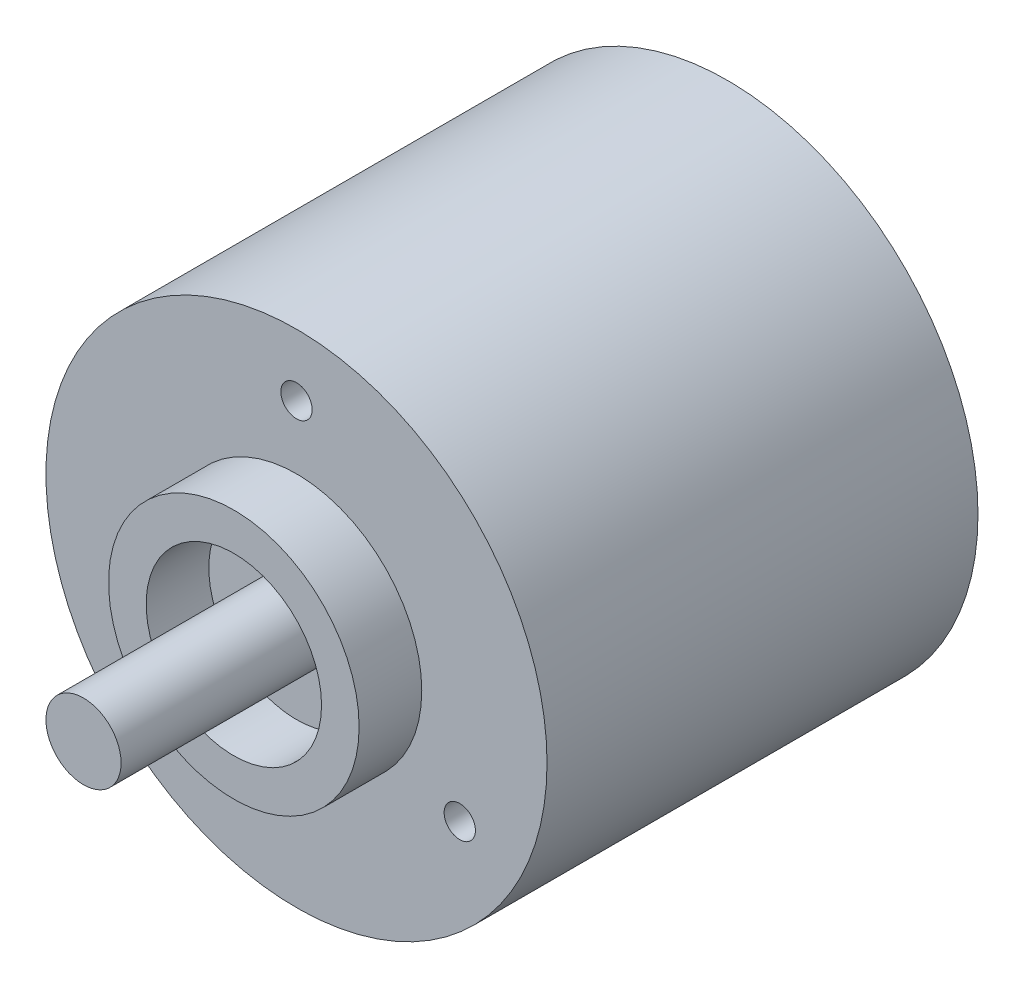
ISO-10303-21;
HEADER;
FILE_DESCRIPTION(('STEP AP214'),'2;1');
FILE_NAME('part.step','',(''),(''),'','','');
FILE_SCHEMA(('AUTOMOTIVE_DESIGN { 1 0 10303 214 1 1 1 1 }'));
ENDSEC;
DATA;
#1=APPLICATION_CONTEXT('core data for automotive mechanical design processes');
#2=APPLICATION_PROTOCOL_DEFINITION('international standard','automotive_design',2000,#1);
#3=PRODUCT_CONTEXT('',#1,'mechanical');
#4=PRODUCT('Part','Part','',(#3));
#5=PRODUCT_RELATED_PRODUCT_CATEGORY('part','',(#4));
#6=PRODUCT_DEFINITION_FORMATION('','',#4);
#7=PRODUCT_DEFINITION_CONTEXT('part definition',#1,'design');
#8=PRODUCT_DEFINITION('design','',#6,#7);
#9=PRODUCT_DEFINITION_SHAPE('','',#8);
#10=(LENGTH_UNIT() NAMED_UNIT(*) SI_UNIT(.MILLI.,.METRE.));
#11=(NAMED_UNIT(*) PLANE_ANGLE_UNIT() SI_UNIT($,.RADIAN.));
#12=(NAMED_UNIT(*) SI_UNIT($,.STERADIAN.) SOLID_ANGLE_UNIT());
#13=UNCERTAINTY_MEASURE_WITH_UNIT(LENGTH_MEASURE(1.E-05),#10,'distance_accuracy_value','');
#14=(GEOMETRIC_REPRESENTATION_CONTEXT(3) GLOBAL_UNCERTAINTY_ASSIGNED_CONTEXT((#13)) GLOBAL_UNIT_ASSIGNED_CONTEXT((#10,
#11,#12)) REPRESENTATION_CONTEXT('',''));
#15=CARTESIAN_POINT('',(0.,0.,0.));
#16=DIRECTION('',(0.,0.,1.));
#17=DIRECTION('',(1.,0.,0.));
#18=AXIS2_PLACEMENT_3D('',#15,#16,#17);
#19=CARTESIAN_POINT('',(0.,0.,-34.4));
#20=DIRECTION('',(0.,0.,1.));
#21=DIRECTION('',(1.,0.,0.));
#22=AXIS2_PLACEMENT_3D('',#19,#20,#21);
#23=CYLINDRICAL_SURFACE('',#22,20.);
#24=CARTESIAN_POINT('',(0.,0.,-34.4));
#25=DIRECTION('',(0.,0.,1.));
#26=DIRECTION('',(1.,0.,0.));
#27=AXIS2_PLACEMENT_3D('',#24,#25,#26);
#28=CIRCLE('',#27,20.);
#29=CARTESIAN_POINT('',(20.,0.,-34.4));
#30=VERTEX_POINT('',#29);
#31=EDGE_CURVE('E38',#30,#30,#28,.T.);
#32=CARTESIAN_POINT('',(0.,0.,0.));
#33=DIRECTION('',(0.,0.,1.));
#34=DIRECTION('',(1.,0.,0.));
#35=AXIS2_PLACEMENT_3D('',#32,#33,#34);
#36=CIRCLE('',#35,20.);
#37=CARTESIAN_POINT('',(20.,0.,0.));
#38=VERTEX_POINT('',#37);
#39=EDGE_CURVE('E42',#38,#38,#36,.T.);
#40=CARTESIAN_POINT('',(20.,0.,-34.4));
#41=CARTESIAN_POINT('',(20.,0.,-34.0416666666667));
#42=CARTESIAN_POINT('',(20.,0.,-33.6833333333333));
#43=CARTESIAN_POINT('',(20.,0.,-32.9666666666667));
#44=CARTESIAN_POINT('',(20.,0.,-32.6083333333333));
#45=CARTESIAN_POINT('',(20.,0.,-31.8916666666667));
#46=CARTESIAN_POINT('',(20.,0.,-31.5333333333333));
#47=CARTESIAN_POINT('',(20.,0.,-30.8166666666667));
#48=CARTESIAN_POINT('',(20.,0.,-30.4583333333333));
#49=CARTESIAN_POINT('',(20.,0.,-29.7416666666667));
#50=CARTESIAN_POINT('',(20.,0.,-29.3833333333333));
#51=CARTESIAN_POINT('',(20.,0.,-28.6666666666667));
#52=CARTESIAN_POINT('',(20.,0.,-28.3083333333333));
#53=CARTESIAN_POINT('',(20.,0.,-27.5916666666667));
#54=CARTESIAN_POINT('',(20.,0.,-27.2333333333333));
#55=CARTESIAN_POINT('',(20.,0.,-26.5166666666667));
#56=CARTESIAN_POINT('',(20.,0.,-26.1583333333333));
#57=CARTESIAN_POINT('',(20.,0.,-25.4416666666667));
#58=CARTESIAN_POINT('',(20.,0.,-25.0833333333333));
#59=CARTESIAN_POINT('',(20.,0.,-24.3666666666667));
#60=CARTESIAN_POINT('',(20.,0.,-24.0083333333333));
#61=CARTESIAN_POINT('',(20.,0.,-23.2916666666667));
#62=CARTESIAN_POINT('',(20.,0.,-22.9333333333333));
#63=CARTESIAN_POINT('',(20.,0.,-22.2166666666667));
#64=CARTESIAN_POINT('',(20.,0.,-21.8583333333333));
#65=CARTESIAN_POINT('',(20.,0.,-21.1416666666667));
#66=CARTESIAN_POINT('',(20.,0.,-20.7833333333333));
#67=CARTESIAN_POINT('',(20.,0.,-20.0666666666667));
#68=CARTESIAN_POINT('',(20.,0.,-19.7083333333333));
#69=CARTESIAN_POINT('',(20.,0.,-18.9916666666667));
#70=CARTESIAN_POINT('',(20.,0.,-18.6333333333333));
#71=CARTESIAN_POINT('',(20.,0.,-17.9166666666667));
#72=CARTESIAN_POINT('',(20.,0.,-17.5583333333333));
#73=CARTESIAN_POINT('',(20.,0.,-16.8416666666667));
#74=CARTESIAN_POINT('',(20.,0.,-16.4833333333333));
#75=CARTESIAN_POINT('',(20.,0.,-15.7666666666667));
#76=CARTESIAN_POINT('',(20.,0.,-15.4083333333333));
#77=CARTESIAN_POINT('',(20.,0.,-14.6916666666667));
#78=CARTESIAN_POINT('',(20.,0.,-14.3333333333333));
#79=CARTESIAN_POINT('',(20.,0.,-13.6166666666667));
#80=CARTESIAN_POINT('',(20.,0.,-13.2583333333333));
#81=CARTESIAN_POINT('',(20.,0.,-12.5416666666667));
#82=CARTESIAN_POINT('',(20.,0.,-12.1833333333333));
#83=CARTESIAN_POINT('',(20.,0.,-11.4666666666667));
#84=CARTESIAN_POINT('',(20.,0.,-11.1083333333333));
#85=CARTESIAN_POINT('',(20.,0.,-10.3916666666667));
#86=CARTESIAN_POINT('',(20.,0.,-10.0333333333333));
#87=CARTESIAN_POINT('',(20.,0.,-9.31666666666667));
#88=CARTESIAN_POINT('',(20.,0.,-8.95833333333334));
#89=CARTESIAN_POINT('',(20.,0.,-8.24166666666667));
#90=CARTESIAN_POINT('',(20.,0.,-7.88333333333334));
#91=CARTESIAN_POINT('',(20.,0.,-7.16666666666667));
#92=CARTESIAN_POINT('',(20.,0.,-6.80833333333334));
#93=CARTESIAN_POINT('',(20.,0.,-6.09166666666667));
#94=CARTESIAN_POINT('',(20.,0.,-5.73333333333334));
#95=CARTESIAN_POINT('',(20.,0.,-5.01666666666667));
#96=CARTESIAN_POINT('',(20.,0.,-4.65833333333334));
#97=CARTESIAN_POINT('',(20.,0.,-3.94166666666667));
#98=CARTESIAN_POINT('',(20.,0.,-3.58333333333334));
#99=CARTESIAN_POINT('',(20.,0.,-2.86666666666667));
#100=CARTESIAN_POINT('',(20.,0.,-2.50833333333334));
#101=CARTESIAN_POINT('',(20.,0.,-1.79166666666667));
#102=CARTESIAN_POINT('',(20.,0.,-1.43333333333334));
#103=CARTESIAN_POINT('',(20.,0.,-0.716666666666673));
#104=CARTESIAN_POINT('',(20.,0.,-0.35833333333334));
#105=CARTESIAN_POINT('',(20.,0.,0.));
#106=B_SPLINE_CURVE_WITH_KNOTS('',3,(#40,#41,#42,#43,#44,#45,#46,#47,#48,#49,#50,#51,#52,#53,
#54,#55,#56,#57,#58,#59,#60,#61,#62,#63,#64,#65,#66,#67,#68,#69,#70,#71,#72,#73,#74,#75,#76,#77,
#78,#79,#80,#81,#82,#83,#84,#85,#86,#87,#88,#89,#90,#91,#92,#93,#94,#95,#96,#97,#98,#99,#100,
#101,#102,#103,#104,#105),.UNSPECIFIED.,.F.,.F.,(4,2,2,2,2,2,2,2,2,2,2,2,2,2,2,2,2,2,2,2,2,2,2,
2,2,2,2,2,2,2,2,2,4),(0.,1.075,2.15,3.225,4.29999999999999,5.37499999999999,6.45,7.525,8.6,
9.675,10.75,11.825,12.9,13.975,15.05,16.125,17.2,18.275,19.35,20.425,21.5,22.575,23.65,24.725,
25.8,26.875,27.95,29.025,30.1,31.175,32.25,33.325,34.4),.UNSPECIFIED.);
#107=EDGE_CURVE('BSEAM32',#30,#38,#106,.T.);
#108=ORIENTED_EDGE('',*,*,#31,.T.);
#109=ORIENTED_EDGE('',*,*,#39,.F.);
#110=ORIENTED_EDGE('',*,*,#107,.T.);
#111=ORIENTED_EDGE('',*,*,#107,.F.);
#112=EDGE_LOOP('',(#108,#110,#109,#111));
#113=FACE_BOUND('',#112,.T.);
#114=ADVANCED_FACE('F32',(#113),#23,.T.);
#115=CARTESIAN_POINT('',(0.,0.,-34.4));
#116=DIRECTION('',(0.,0.,1.));
#117=DIRECTION('',(1.,0.,0.));
#118=AXIS2_PLACEMENT_3D('',#115,#116,#117);
#119=PLANE('',#118);
#120=ORIENTED_EDGE('',*,*,#31,.F.);
#121=EDGE_LOOP('',(#120));
#122=FACE_BOUND('',#121,.T.);
#123=ADVANCED_FACE('F95',(#122),#119,.F.);
#124=CARTESIAN_POINT('',(0.,0.,0.));
#125=DIRECTION('',(0.,0.,1.));
#126=DIRECTION('',(1.,0.,0.));
#127=AXIS2_PLACEMENT_3D('',#124,#125,#126);
#128=PLANE('',#127);
#129=CARTESIAN_POINT('',(-13.0336823269548,-7.52500000000056,0.));
#130=DIRECTION('',(0.,0.,1.));
#131=DIRECTION('',(1.,0.,0.));
#132=AXIS2_PLACEMENT_3D('',#129,#130,#131);
#133=CIRCLE('',#132,1.25000000000122);
#134=CARTESIAN_POINT('',(-11.7836823269536,-7.52500000000056,0.));
#135=VERTEX_POINT('',#134);
#136=EDGE_CURVE('E76',#135,#135,#133,.T.);
#137=ORIENTED_EDGE('',*,*,#136,.F.);
#138=EDGE_LOOP('',(#137));
#139=FACE_BOUND('',#138,.T.);
#140=CARTESIAN_POINT('',(13.0336823269568,-7.52499999999944,0.));
#141=DIRECTION('',(0.,0.,1.));
#142=DIRECTION('',(1.,0.,0.));
#143=AXIS2_PLACEMENT_3D('',#140,#141,#142);
#144=CIRCLE('',#143,1.25000000000083);
#145=CARTESIAN_POINT('',(14.2836823269576,-7.52499999999944,0.));
#146=VERTEX_POINT('',#145);
#147=EDGE_CURVE('E70',#146,#146,#144,.T.);
#148=ORIENTED_EDGE('',*,*,#147,.F.);
#149=EDGE_LOOP('',(#148));
#150=FACE_BOUND('',#149,.T.);
#151=CARTESIAN_POINT('',(0.,15.05,0.));
#152=DIRECTION('',(0.,0.,1.));
#153=DIRECTION('',(1.,0.,0.));
#154=AXIS2_PLACEMENT_3D('',#151,#152,#153);
#155=CIRCLE('',#154,1.25);
#156=CARTESIAN_POINT('',(1.25,15.05,0.));
#157=VERTEX_POINT('',#156);
#158=EDGE_CURVE('E64',#157,#157,#155,.T.);
#159=ORIENTED_EDGE('',*,*,#158,.F.);
#160=EDGE_LOOP('',(#159));
#161=FACE_BOUND('',#160,.T.);
#162=CARTESIAN_POINT('',(0.,0.,0.));
#163=DIRECTION('',(0.,0.,1.));
#164=DIRECTION('',(1.,0.,0.));
#165=AXIS2_PLACEMENT_3D('',#162,#163,#164);
#166=CIRCLE('',#165,10.);
#167=CARTESIAN_POINT('',(10.,0.,0.));
#168=VERTEX_POINT('',#167);
#169=EDGE_CURVE('E49',#168,#168,#166,.T.);
#170=ORIENTED_EDGE('',*,*,#169,.F.);
#171=EDGE_LOOP('',(#170));
#172=FACE_BOUND('',#171,.T.);
#173=ORIENTED_EDGE('',*,*,#39,.T.);
#174=EDGE_LOOP('',(#173));
#175=FACE_BOUND('',#174,.T.);
#176=ADVANCED_FACE('F91',(#139,#150,#161,#172,#175),#128,.T.);
#177=CARTESIAN_POINT('',(0.,0.,5.));
#178=DIRECTION('',(0.,0.,1.));
#179=DIRECTION('',(1.,0.,0.));
#180=AXIS2_PLACEMENT_3D('',#177,#178,#179);
#181=PLANE('',#180);
#182=CARTESIAN_POINT('',(0.,0.,5.));
#183=DIRECTION('',(0.,0.,1.));
#184=DIRECTION('',(1.,0.,0.));
#185=AXIS2_PLACEMENT_3D('',#182,#183,#184);
#186=CIRCLE('',#185,10.);
#187=CARTESIAN_POINT('',(10.,0.,5.));
#188=VERTEX_POINT('',#187);
#189=EDGE_CURVE('E47',#188,#188,#186,.T.);
#190=ORIENTED_EDGE('',*,*,#189,.T.);
#191=EDGE_LOOP('',(#190));
#192=FACE_BOUND('',#191,.T.);
#193=CARTESIAN_POINT('',(0.,0.,5.));
#194=DIRECTION('',(0.,0.,1.));
#195=DIRECTION('',(1.,0.,0.));
#196=AXIS2_PLACEMENT_3D('',#193,#194,#195);
#197=CIRCLE('',#196,7.);
#198=CARTESIAN_POINT('',(7.,0.,5.));
#199=VERTEX_POINT('',#198);
#200=EDGE_CURVE('E52',#199,#199,#197,.T.);
#201=ORIENTED_EDGE('',*,*,#200,.F.);
#202=EDGE_LOOP('',(#201));
#203=FACE_BOUND('',#202,.T.);
#204=ADVANCED_FACE('F94',(#192,#203),#181,.T.);
#205=CARTESIAN_POINT('',(0.,0.,5.));
#206=DIRECTION('',(0.,0.,-1.));
#207=DIRECTION('',(-1.,0.,0.));
#208=AXIS2_PLACEMENT_3D('',#205,#206,#207);
#209=CYLINDRICAL_SURFACE('',#208,10.);
#210=ORIENTED_EDGE('',*,*,#189,.F.);
#211=EDGE_LOOP('',(#210));
#212=FACE_BOUND('',#211,.T.);
#213=ORIENTED_EDGE('',*,*,#169,.T.);
#214=EDGE_LOOP('',(#213));
#215=FACE_BOUND('',#214,.T.);
#216=ADVANCED_FACE('F114',(#212,#215),#209,.T.);
#217=CARTESIAN_POINT('',(0.,0.,5.));
#218=DIRECTION('',(0.,0.,-1.));
#219=DIRECTION('',(-1.,0.,0.));
#220=AXIS2_PLACEMENT_3D('',#217,#218,#219);
#221=CYLINDRICAL_SURFACE('',#220,7.);
#222=ORIENTED_EDGE('',*,*,#200,.T.);
#223=EDGE_LOOP('',(#222));
#224=FACE_BOUND('',#223,.T.);
#225=CARTESIAN_POINT('',(0.,0.,0.));
#226=DIRECTION('',(0.,0.,1.));
#227=DIRECTION('',(1.,0.,0.));
#228=AXIS2_PLACEMENT_3D('',#225,#226,#227);
#229=CIRCLE('',#228,7.);
#230=CARTESIAN_POINT('',(7.,0.,0.));
#231=VERTEX_POINT('',#230);
#232=EDGE_CURVE('E10',#231,#231,#229,.F.);
#233=ORIENTED_EDGE('',*,*,#232,.T.);
#234=EDGE_LOOP('',(#233));
#235=FACE_BOUND('',#234,.T.);
#236=ADVANCED_FACE('F117',(#224,#235),#221,.F.);
#237=CARTESIAN_POINT('',(0.,0.,0.));
#238=DIRECTION('',(0.,0.,1.));
#239=DIRECTION('',(1.,0.,0.));
#240=AXIS2_PLACEMENT_3D('',#237,#238,#239);
#241=CIRCLE('',#240,3.);
#242=CARTESIAN_POINT('',(3.,0.,0.));
#243=VERTEX_POINT('',#242);
#244=EDGE_CURVE('E58',#243,#243,#241,.T.);
#245=ORIENTED_EDGE('',*,*,#244,.F.);
#246=EDGE_LOOP('',(#245));
#247=FACE_BOUND('',#246,.T.);
#248=ORIENTED_EDGE('',*,*,#232,.F.);
#249=EDGE_LOOP('',(#248));
#250=FACE_BOUND('',#249,.T.);
#251=ADVANCED_FACE('F96',(#247,#250),#128,.T.);
#252=CARTESIAN_POINT('',(0.,0.,17.));
#253=DIRECTION('',(0.,0.,-1.));
#254=DIRECTION('',(-1.,0.,0.));
#255=AXIS2_PLACEMENT_3D('',#252,#253,#254);
#256=CYLINDRICAL_SURFACE('',#255,3.);
#257=CARTESIAN_POINT('',(0.,0.,17.));
#258=DIRECTION('',(0.,0.,1.));
#259=DIRECTION('',(1.,0.,0.));
#260=AXIS2_PLACEMENT_3D('',#257,#258,#259);
#261=CIRCLE('',#260,3.);
#262=CARTESIAN_POINT('',(3.,0.,17.));
#263=VERTEX_POINT('',#262);
#264=EDGE_CURVE('E57',#263,#263,#261,.T.);
#265=ORIENTED_EDGE('',*,*,#264,.F.);
#266=EDGE_LOOP('',(#265));
#267=FACE_BOUND('',#266,.T.);
#268=ORIENTED_EDGE('',*,*,#244,.T.);
#269=EDGE_LOOP('',(#268));
#270=FACE_BOUND('',#269,.T.);
#271=ADVANCED_FACE('F125',(#267,#270),#256,.T.);
#272=CARTESIAN_POINT('',(0.,0.,17.));
#273=DIRECTION('',(0.,0.,1.));
#274=DIRECTION('',(1.,0.,0.));
#275=AXIS2_PLACEMENT_3D('',#272,#273,#274);
#276=PLANE('',#275);
#277=ORIENTED_EDGE('',*,*,#264,.T.);
#278=EDGE_LOOP('',(#277));
#279=FACE_BOUND('',#278,.T.);
#280=ADVANCED_FACE('F128',(#279),#276,.T.);
#281=CARTESIAN_POINT('',(0.,15.05,-7.9));
#282=DIRECTION('',(0.,0.,1.));
#283=DIRECTION('',(1.,0.,0.));
#284=AXIS2_PLACEMENT_3D('',#281,#282,#283);
#285=CYLINDRICAL_SURFACE('',#284,1.25);
#286=CARTESIAN_POINT('',(0.,15.05,-7.9));
#287=DIRECTION('',(0.,0.,1.));
#288=DIRECTION('',(1.,0.,0.));
#289=AXIS2_PLACEMENT_3D('',#286,#287,#288);
#290=CIRCLE('',#289,1.25);
#291=CARTESIAN_POINT('',(1.25,15.05,-7.9));
#292=VERTEX_POINT('',#291);
#293=EDGE_CURVE('E61',#292,#292,#290,.T.);
#294=ORIENTED_EDGE('',*,*,#293,.F.);
#295=EDGE_LOOP('',(#294));
#296=FACE_BOUND('',#295,.T.);
#297=ORIENTED_EDGE('',*,*,#158,.T.);
#298=EDGE_LOOP('',(#297));
#299=FACE_BOUND('',#298,.T.);
#300=ADVANCED_FACE('F132',(#296,#299),#285,.F.);
#301=CARTESIAN_POINT('',(0.,15.05,-7.9));
#302=DIRECTION('',(0.,0.,1.));
#303=DIRECTION('',(1.,0.,0.));
#304=AXIS2_PLACEMENT_3D('',#301,#302,#303);
#305=PLANE('',#304);
#306=ORIENTED_EDGE('',*,*,#293,.T.);
#307=EDGE_LOOP('',(#306));
#308=FACE_BOUND('',#307,.T.);
#309=ADVANCED_FACE('F136',(#308),#305,.T.);
#310=CARTESIAN_POINT('',(13.0336823269568,-7.52499999999944,-7.9));
#311=DIRECTION('',(0.,0.,1.));
#312=DIRECTION('',(1.,0.,0.));
#313=AXIS2_PLACEMENT_3D('',#310,#311,#312);
#314=CYLINDRICAL_SURFACE('',#313,1.25000000000083);
#315=CARTESIAN_POINT('',(13.0336823269568,-7.52499999999944,-7.9));
#316=DIRECTION('',(0.,0.,1.));
#317=DIRECTION('',(1.,0.,0.));
#318=AXIS2_PLACEMENT_3D('',#315,#316,#317);
#319=CIRCLE('',#318,1.25000000000083);
#320=CARTESIAN_POINT('',(14.2836823269576,-7.52499999999944,-7.9));
#321=VERTEX_POINT('',#320);
#322=EDGE_CURVE('E67',#321,#321,#319,.T.);
#323=ORIENTED_EDGE('',*,*,#322,.F.);
#324=EDGE_LOOP('',(#323));
#325=FACE_BOUND('',#324,.T.);
#326=ORIENTED_EDGE('',*,*,#147,.T.);
#327=EDGE_LOOP('',(#326));
#328=FACE_BOUND('',#327,.T.);
#329=ADVANCED_FACE('F140',(#325,#328),#314,.F.);
#330=CARTESIAN_POINT('',(13.0336823269568,-7.52499999999944,-7.9));
#331=DIRECTION('',(0.,0.,1.));
#332=DIRECTION('',(1.,0.,0.));
#333=AXIS2_PLACEMENT_3D('',#330,#331,#332);
#334=PLANE('',#333);
#335=ORIENTED_EDGE('',*,*,#322,.T.);
#336=EDGE_LOOP('',(#335));
#337=FACE_BOUND('',#336,.T.);
#338=ADVANCED_FACE('F87',(#337),#334,.T.);
#339=CARTESIAN_POINT('',(-13.0336823269548,-7.52500000000056,-7.9));
#340=DIRECTION('',(0.,0.,1.));
#341=DIRECTION('',(1.,0.,0.));
#342=AXIS2_PLACEMENT_3D('',#339,#340,#341);
#343=CYLINDRICAL_SURFACE('',#342,1.25000000000122);
#344=CARTESIAN_POINT('',(-13.0336823269548,-7.52500000000056,-7.9));
#345=DIRECTION('',(0.,0.,1.));
#346=DIRECTION('',(1.,0.,0.));
#347=AXIS2_PLACEMENT_3D('',#344,#345,#346);
#348=CIRCLE('',#347,1.25000000000122);
#349=CARTESIAN_POINT('',(-11.7836823269536,-7.52500000000056,-7.9));
#350=VERTEX_POINT('',#349);
#351=EDGE_CURVE('E73',#350,#350,#348,.T.);
#352=ORIENTED_EDGE('',*,*,#351,.F.);
#353=EDGE_LOOP('',(#352));
#354=FACE_BOUND('',#353,.T.);
#355=ORIENTED_EDGE('',*,*,#136,.T.);
#356=EDGE_LOOP('',(#355));
#357=FACE_BOUND('',#356,.T.);
#358=ADVANCED_FACE('F84',(#354,#357),#343,.F.);
#359=CARTESIAN_POINT('',(-13.0336823269548,-7.52500000000056,-7.9));
#360=DIRECTION('',(0.,0.,1.));
#361=DIRECTION('',(1.,0.,0.));
#362=AXIS2_PLACEMENT_3D('',#359,#360,#361);
#363=PLANE('',#362);
#364=ORIENTED_EDGE('',*,*,#351,.T.);
#365=EDGE_LOOP('',(#364));
#366=FACE_BOUND('',#365,.T.);
#367=ADVANCED_FACE('F82',(#366),#363,.T.);
#368=CLOSED_SHELL('',(#114,#123,#176,#204,#216,#236,#251,#271,#280,#300,#309,#329,#338,#358,#367));
#369=MANIFOLD_SOLID_BREP('B2',#368);
#370=ADVANCED_BREP_SHAPE_REPRESENTATION('',(#18,#369),#14);
#371=SHAPE_DEFINITION_REPRESENTATION(#9,#370);
ENDSEC;
END-ISO-10303-21;
